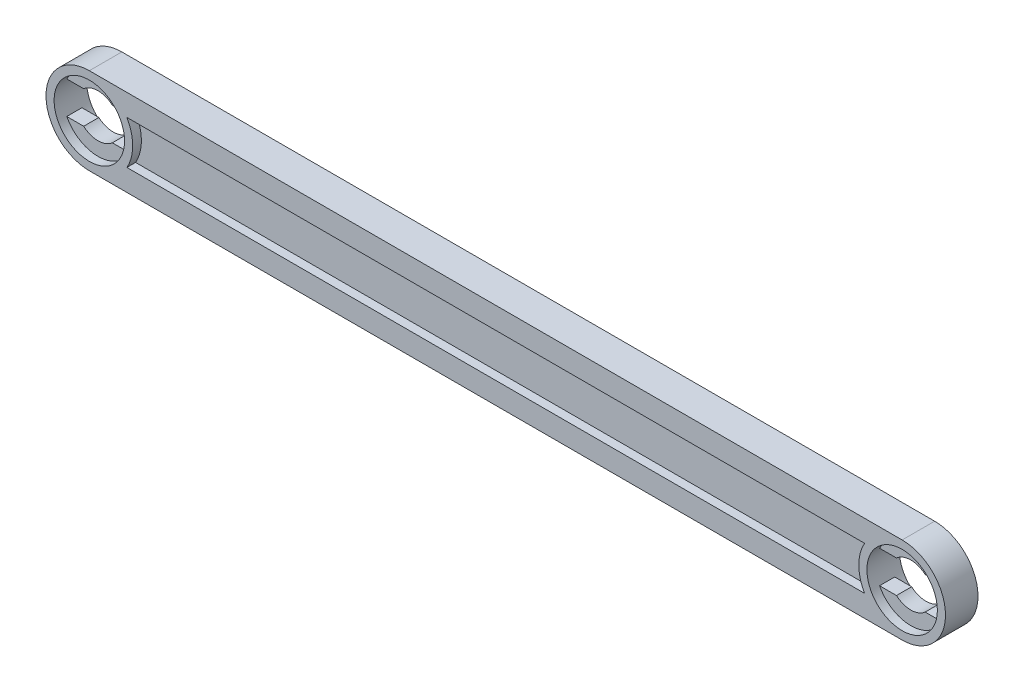
ISO-10303-21;
HEADER;
FILE_DESCRIPTION(('STEP AP214'),'2;1');
FILE_NAME('part.step','',(''),(''),'','','');
FILE_SCHEMA(('AUTOMOTIVE_DESIGN { 1 0 10303 214 1 1 1 1 }'));
ENDSEC;
DATA;
#1=APPLICATION_CONTEXT('core data for automotive mechanical design processes');
#2=APPLICATION_PROTOCOL_DEFINITION('international standard','automotive_design',2000,#1);
#3=PRODUCT_CONTEXT('',#1,'mechanical');
#4=PRODUCT('Part','Part','',(#3));
#5=PRODUCT_RELATED_PRODUCT_CATEGORY('part','',(#4));
#6=PRODUCT_DEFINITION_FORMATION('','',#4);
#7=PRODUCT_DEFINITION_CONTEXT('part definition',#1,'design');
#8=PRODUCT_DEFINITION('design','',#6,#7);
#9=PRODUCT_DEFINITION_SHAPE('','',#8);
#10=(LENGTH_UNIT() NAMED_UNIT(*) SI_UNIT(.MILLI.,.METRE.));
#11=(NAMED_UNIT(*) PLANE_ANGLE_UNIT() SI_UNIT($,.RADIAN.));
#12=(NAMED_UNIT(*) SI_UNIT($,.STERADIAN.) SOLID_ANGLE_UNIT());
#13=UNCERTAINTY_MEASURE_WITH_UNIT(LENGTH_MEASURE(1.E-05),#10,'distance_accuracy_value','');
#14=(GEOMETRIC_REPRESENTATION_CONTEXT(3) GLOBAL_UNCERTAINTY_ASSIGNED_CONTEXT((#13)) GLOBAL_UNIT_ASSIGNED_CONTEXT((#10,
#11,#12)) REPRESENTATION_CONTEXT('',''));
#15=CARTESIAN_POINT('',(0.,0.,0.));
#16=DIRECTION('',(0.,0.,1.));
#17=DIRECTION('',(1.,0.,0.));
#18=AXIS2_PLACEMENT_3D('',#15,#16,#17);
#19=CARTESIAN_POINT('',(0.,0.,0.));
#20=DIRECTION('',(0.,0.,1.));
#21=DIRECTION('',(1.,0.,0.));
#22=AXIS2_PLACEMENT_3D('',#19,#20,#21);
#23=PLANE('',#22);
#24=CARTESIAN_POINT('',(75.,0.,0.));
#25=DIRECTION('',(0.,0.,-1.));
#26=DIRECTION('',(1.,0.,0.));
#27=AXIS2_PLACEMENT_3D('',#24,#25,#26);
#28=CIRCLE('',#27,3.99999999999999);
#29=CARTESIAN_POINT('',(71.5358983848623,-2.,0.));
#30=VERTEX_POINT('',#29);
#31=CARTESIAN_POINT('',(71.5358983848623,2.,0.));
#32=VERTEX_POINT('',#31);
#33=EDGE_CURVE('E57',#30,#32,#28,.T.);
#34=ORIENTED_EDGE('',*,*,#33,.F.);
#35=DIRECTION('',(1.,0.,0.));
#36=VECTOR('',#35,1.);
#37=CARTESIAN_POINT('',(3.46410161513775,-2.,0.));
#38=LINE('',#37,#36);
#39=CARTESIAN_POINT('',(3.46410161513775,-2.,0.));
#40=VERTEX_POINT('',#39);
#41=EDGE_CURVE('E261',#40,#30,#38,.T.);
#42=ORIENTED_EDGE('',*,*,#41,.F.);
#43=CARTESIAN_POINT('',(0.,0.,0.));
#44=DIRECTION('',(0.,0.,-1.));
#45=DIRECTION('',(1.,0.,0.));
#46=AXIS2_PLACEMENT_3D('',#43,#44,#45);
#47=CIRCLE('',#46,4.);
#48=CARTESIAN_POINT('',(3.46410161513776,2.,0.));
#49=VERTEX_POINT('',#48);
#50=EDGE_CURVE('E275',#49,#40,#47,.T.);
#51=ORIENTED_EDGE('',*,*,#50,.F.);
#52=DIRECTION('',(-1.,0.,0.));
#53=VECTOR('',#52,1.);
#54=CARTESIAN_POINT('',(3.46410161513775,2.,0.));
#55=LINE('',#54,#53);
#56=EDGE_CURVE('E272',#32,#49,#55,.T.);
#57=ORIENTED_EDGE('',*,*,#56,.F.);
#58=EDGE_LOOP('',(#34,#42,#51,#57));
#59=FACE_BOUND('',#58,.T.);
#60=CARTESIAN_POINT('',(0.,0.,0.));
#61=DIRECTION('',(0.,0.,1.));
#62=DIRECTION('',(1.,0.,0.));
#63=AXIS2_PLACEMENT_3D('',#60,#61,#62);
#64=CIRCLE('',#63,4.);
#65=CARTESIAN_POINT('',(0.,4.,0.));
#66=VERTEX_POINT('',#65);
#67=CARTESIAN_POINT('',(0.,-4.,0.));
#68=VERTEX_POINT('',#67);
#69=EDGE_CURVE('E393',#66,#68,#64,.T.);
#70=ORIENTED_EDGE('',*,*,#69,.T.);
#71=DIRECTION('',(1.,0.,0.));
#72=VECTOR('',#71,1.);
#73=CARTESIAN_POINT('',(0.,-4.,0.));
#74=LINE('',#73,#72);
#75=CARTESIAN_POINT('',(75.,-4.,0.));
#76=VERTEX_POINT('',#75);
#77=EDGE_CURVE('E423',#68,#76,#74,.T.);
#78=ORIENTED_EDGE('',*,*,#77,.T.);
#79=CARTESIAN_POINT('',(75.,0.,0.));
#80=DIRECTION('',(0.,0.,1.));
#81=DIRECTION('',(1.,0.,0.));
#82=AXIS2_PLACEMENT_3D('',#79,#80,#81);
#83=CIRCLE('',#82,4.);
#84=CARTESIAN_POINT('',(75.,4.,0.));
#85=VERTEX_POINT('',#84);
#86=EDGE_CURVE('E426',#76,#85,#83,.T.);
#87=ORIENTED_EDGE('',*,*,#86,.T.);
#88=DIRECTION('',(-1.,0.,0.));
#89=VECTOR('',#88,1.);
#90=CARTESIAN_POINT('',(0.,4.,0.));
#91=LINE('',#90,#89);
#92=EDGE_CURVE('E411',#85,#66,#91,.T.);
#93=ORIENTED_EDGE('',*,*,#92,.T.);
#94=EDGE_LOOP('',(#70,#78,#87,#93));
#95=FACE_BOUND('',#94,.T.);
#96=CARTESIAN_POINT('',(0.,0.,0.));
#97=DIRECTION('',(0.,0.,1.));
#98=DIRECTION('',(1.,0.,0.));
#99=AXIS2_PLACEMENT_3D('',#96,#97,#98);
#100=CIRCLE('',#99,3.25);
#101=CARTESIAN_POINT('',(3.25,0.,0.));
#102=VERTEX_POINT('',#101);
#103=EDGE_CURVE('E387',#102,#102,#100,.T.);
#104=ORIENTED_EDGE('',*,*,#103,.F.);
#105=EDGE_LOOP('',(#104));
#106=FACE_BOUND('',#105,.T.);
#107=CARTESIAN_POINT('',(75.,0.,0.));
#108=DIRECTION('',(0.,0.,-1.));
#109=DIRECTION('',(-1.,0.,0.));
#110=AXIS2_PLACEMENT_3D('',#107,#108,#109);
#111=CIRCLE('',#110,3.25);
#112=CARTESIAN_POINT('',(71.75,0.,0.));
#113=VERTEX_POINT('',#112);
#114=EDGE_CURVE('E324',#113,#113,#111,.T.);
#115=ORIENTED_EDGE('',*,*,#114,.T.);
#116=EDGE_LOOP('',(#115));
#117=FACE_BOUND('',#116,.T.);
#118=ADVANCED_FACE('F34',(#59,#95,#106,#117),#23,.T.);
#119=CARTESIAN_POINT('',(77.8831406486677,-1.5,-3.001));
#120=DIRECTION('',(0.,1.,0.));
#121=DIRECTION('',(0.,0.,1.));
#122=AXIS2_PLACEMENT_3D('',#119,#120,#121);
#123=PLANE('',#122);
#124=DIRECTION('',(1.,0.,0.));
#125=VECTOR('',#124,1.);
#126=CARTESIAN_POINT('',(77.8831406486677,-1.5,-2.2));
#127=LINE('',#126,#125);
#128=CARTESIAN_POINT('',(76.3228756555323,-1.5,-2.2));
#129=VERTEX_POINT('',#128);
#130=CARTESIAN_POINT('',(77.8831406486677,-1.5,-2.2));
#131=VERTEX_POINT('',#130);
#132=EDGE_CURVE('E300',#129,#131,#127,.T.);
#133=ORIENTED_EDGE('',*,*,#132,.F.);
#134=DIRECTION('',(0.,0.,1.));
#135=VECTOR('',#134,1.);
#136=CARTESIAN_POINT('',(76.3228756555323,-1.5,-3.001));
#137=LINE('',#136,#135);
#138=CARTESIAN_POINT('',(76.3228756555323,-1.5,-0.8));
#139=VERTEX_POINT('',#138);
#140=EDGE_CURVE('E331',#129,#139,#137,.T.);
#141=ORIENTED_EDGE('',*,*,#140,.T.);
#142=DIRECTION('',(1.,0.,0.));
#143=VECTOR('',#142,1.);
#144=CARTESIAN_POINT('',(77.8831406486677,-1.5,-0.8));
#145=LINE('',#144,#143);
#146=CARTESIAN_POINT('',(77.8831406486677,-1.5,-0.8));
#147=VERTEX_POINT('',#146);
#148=EDGE_CURVE('E318',#139,#147,#145,.T.);
#149=ORIENTED_EDGE('',*,*,#148,.T.);
#150=DIRECTION('',(0.,0.,1.));
#151=VECTOR('',#150,1.);
#152=CARTESIAN_POINT('',(77.8831406486677,-1.5,-3.001));
#153=LINE('',#152,#151);
#154=EDGE_CURVE('E328',#131,#147,#153,.T.);
#155=ORIENTED_EDGE('',*,*,#154,.F.);
#156=EDGE_LOOP('',(#133,#141,#149,#155));
#157=FACE_BOUND('',#156,.T.);
#158=ADVANCED_FACE('F476',(#157),#123,.T.);
#159=CARTESIAN_POINT('',(75.,0.,-3.001));
#160=DIRECTION('',(0.,0.,1.));
#161=DIRECTION('',(1.,0.,0.));
#162=AXIS2_PLACEMENT_3D('',#159,#160,#161);
#163=CYLINDRICAL_SURFACE('',#162,2.);
#164=CARTESIAN_POINT('',(75.,0.,-2.2));
#165=DIRECTION('',(0.,0.,1.));
#166=DIRECTION('',(1.,0.,0.));
#167=AXIS2_PLACEMENT_3D('',#164,#165,#166);
#168=CIRCLE('',#167,2.);
#169=CARTESIAN_POINT('',(73.6771243444677,-1.5,-2.2));
#170=VERTEX_POINT('',#169);
#171=EDGE_CURVE('E298',#170,#129,#168,.T.);
#172=ORIENTED_EDGE('',*,*,#171,.F.);
#173=DIRECTION('',(0.,0.,1.));
#174=VECTOR('',#173,1.);
#175=CARTESIAN_POINT('',(73.6771243444677,-1.5,-3.001));
#176=LINE('',#175,#174);
#177=CARTESIAN_POINT('',(73.6771243444677,-1.5,-0.800000000000001));
#178=VERTEX_POINT('',#177);
#179=EDGE_CURVE('E333',#170,#178,#176,.T.);
#180=ORIENTED_EDGE('',*,*,#179,.T.);
#181=CARTESIAN_POINT('',(75.,0.,-0.8));
#182=DIRECTION('',(0.,0.,1.));
#183=DIRECTION('',(1.,0.,0.));
#184=AXIS2_PLACEMENT_3D('',#181,#182,#183);
#185=CIRCLE('',#184,2.);
#186=EDGE_CURVE('E315',#178,#139,#185,.T.);
#187=ORIENTED_EDGE('',*,*,#186,.T.);
#188=ORIENTED_EDGE('',*,*,#140,.F.);
#189=EDGE_LOOP('',(#172,#180,#187,#188));
#190=FACE_BOUND('',#189,.T.);
#191=ADVANCED_FACE('F482',(#190),#163,.F.);
#192=CARTESIAN_POINT('',(73.6771243444677,-1.5,-3.001));
#193=DIRECTION('',(0.,1.,0.));
#194=DIRECTION('',(0.,0.,1.));
#195=AXIS2_PLACEMENT_3D('',#192,#193,#194);
#196=PLANE('',#195);
#197=DIRECTION('',(1.,0.,0.));
#198=VECTOR('',#197,1.);
#199=CARTESIAN_POINT('',(73.6771243444677,-1.5,-2.2));
#200=LINE('',#199,#198);
#201=CARTESIAN_POINT('',(72.1168593513323,-1.5,-2.2));
#202=VERTEX_POINT('',#201);
#203=EDGE_CURVE('E296',#202,#170,#200,.T.);
#204=ORIENTED_EDGE('',*,*,#203,.F.);
#205=DIRECTION('',(0.,0.,1.));
#206=VECTOR('',#205,1.);
#207=CARTESIAN_POINT('',(72.1168593513323,-1.5,-3.001));
#208=LINE('',#207,#206);
#209=CARTESIAN_POINT('',(72.1168593513323,-1.5,-0.8));
#210=VERTEX_POINT('',#209);
#211=EDGE_CURVE('E335',#202,#210,#208,.T.);
#212=ORIENTED_EDGE('',*,*,#211,.T.);
#213=DIRECTION('',(1.,0.,0.));
#214=VECTOR('',#213,1.);
#215=CARTESIAN_POINT('',(73.6771243444677,-1.5,-0.8));
#216=LINE('',#215,#214);
#217=EDGE_CURVE('E312',#210,#178,#216,.T.);
#218=ORIENTED_EDGE('',*,*,#217,.T.);
#219=ORIENTED_EDGE('',*,*,#179,.F.);
#220=EDGE_LOOP('',(#204,#212,#218,#219));
#221=FACE_BOUND('',#220,.T.);
#222=ADVANCED_FACE('F586',(#221),#196,.T.);
#223=CARTESIAN_POINT('',(73.6771243444677,1.5,-3.001));
#224=DIRECTION('',(0.,-1.,0.));
#225=DIRECTION('',(0.,0.,-1.));
#226=AXIS2_PLACEMENT_3D('',#223,#224,#225);
#227=PLANE('',#226);
#228=DIRECTION('',(-1.,0.,0.));
#229=VECTOR('',#228,1.);
#230=CARTESIAN_POINT('',(73.6771243444677,1.5,-2.2));
#231=LINE('',#230,#229);
#232=CARTESIAN_POINT('',(73.6771243444677,1.5,-2.2));
#233=VERTEX_POINT('',#232);
#234=CARTESIAN_POINT('',(72.1168593513323,1.5,-2.2));
#235=VERTEX_POINT('',#234);
#236=EDGE_CURVE('E294',#233,#235,#231,.T.);
#237=ORIENTED_EDGE('',*,*,#236,.F.);
#238=DIRECTION('',(0.,0.,1.));
#239=VECTOR('',#238,1.);
#240=CARTESIAN_POINT('',(73.6771243444677,1.5,-3.001));
#241=LINE('',#240,#239);
#242=CARTESIAN_POINT('',(73.6771243444677,1.5,-0.8));
#243=VERTEX_POINT('',#242);
#244=EDGE_CURVE('E339',#233,#243,#241,.T.);
#245=ORIENTED_EDGE('',*,*,#244,.T.);
#246=DIRECTION('',(-1.,0.,0.));
#247=VECTOR('',#246,1.);
#248=CARTESIAN_POINT('',(73.6771243444677,1.5,-0.8));
#249=LINE('',#248,#247);
#250=CARTESIAN_POINT('',(72.1168593513323,1.5,-0.8));
#251=VERTEX_POINT('',#250);
#252=EDGE_CURVE('E309',#243,#251,#249,.T.);
#253=ORIENTED_EDGE('',*,*,#252,.T.);
#254=DIRECTION('',(0.,0.,1.));
#255=VECTOR('',#254,1.);
#256=CARTESIAN_POINT('',(72.1168593513323,1.5,-3.001));
#257=LINE('',#256,#255);
#258=EDGE_CURVE('E337',#235,#251,#257,.T.);
#259=ORIENTED_EDGE('',*,*,#258,.F.);
#260=EDGE_LOOP('',(#237,#245,#253,#259));
#261=FACE_BOUND('',#260,.T.);
#262=ADVANCED_FACE('F590',(#261),#227,.T.);
#263=CARTESIAN_POINT('',(75.,0.,-3.001));
#264=DIRECTION('',(0.,0.,1.));
#265=DIRECTION('',(1.,0.,0.));
#266=AXIS2_PLACEMENT_3D('',#263,#264,#265);
#267=CYLINDRICAL_SURFACE('',#266,2.);
#268=CARTESIAN_POINT('',(75.,0.,-2.2));
#269=DIRECTION('',(0.,0.,1.));
#270=DIRECTION('',(1.,0.,0.));
#271=AXIS2_PLACEMENT_3D('',#268,#269,#270);
#272=CIRCLE('',#271,2.);
#273=CARTESIAN_POINT('',(76.3228756555323,1.5,-2.2));
#274=VERTEX_POINT('',#273);
#275=EDGE_CURVE('E292',#274,#233,#272,.T.);
#276=ORIENTED_EDGE('',*,*,#275,.F.);
#277=DIRECTION('',(0.,0.,1.));
#278=VECTOR('',#277,1.);
#279=CARTESIAN_POINT('',(76.3228756555323,1.5,-3.001));
#280=LINE('',#279,#278);
#281=CARTESIAN_POINT('',(76.3228756555323,1.5,-0.800000000000001));
#282=VERTEX_POINT('',#281);
#283=EDGE_CURVE('E341',#274,#282,#280,.T.);
#284=ORIENTED_EDGE('',*,*,#283,.T.);
#285=CARTESIAN_POINT('',(75.,0.,-0.8));
#286=DIRECTION('',(0.,0.,1.));
#287=DIRECTION('',(1.,0.,0.));
#288=AXIS2_PLACEMENT_3D('',#285,#286,#287);
#289=CIRCLE('',#288,2.);
#290=EDGE_CURVE('E306',#282,#243,#289,.T.);
#291=ORIENTED_EDGE('',*,*,#290,.T.);
#292=ORIENTED_EDGE('',*,*,#244,.F.);
#293=EDGE_LOOP('',(#276,#284,#291,#292));
#294=FACE_BOUND('',#293,.T.);
#295=ADVANCED_FACE('F532',(#294),#267,.F.);
#296=CARTESIAN_POINT('',(77.8831406486677,1.5,-3.001));
#297=DIRECTION('',(0.,-1.,0.));
#298=DIRECTION('',(0.,0.,-1.));
#299=AXIS2_PLACEMENT_3D('',#296,#297,#298);
#300=PLANE('',#299);
#301=DIRECTION('',(-1.,0.,0.));
#302=VECTOR('',#301,1.);
#303=CARTESIAN_POINT('',(77.8831406486677,1.5,-2.2));
#304=LINE('',#303,#302);
#305=CARTESIAN_POINT('',(77.8831406486677,1.5,-2.2));
#306=VERTEX_POINT('',#305);
#307=EDGE_CURVE('E290',#306,#274,#304,.T.);
#308=ORIENTED_EDGE('',*,*,#307,.F.);
#309=DIRECTION('',(0.,0.,1.));
#310=VECTOR('',#309,1.);
#311=CARTESIAN_POINT('',(77.8831406486677,1.5,-3.001));
#312=LINE('',#311,#310);
#313=CARTESIAN_POINT('',(77.8831406486677,1.5,-0.8));
#314=VERTEX_POINT('',#313);
#315=EDGE_CURVE('E327',#306,#314,#312,.T.);
#316=ORIENTED_EDGE('',*,*,#315,.T.);
#317=DIRECTION('',(-1.,0.,0.));
#318=VECTOR('',#317,1.);
#319=CARTESIAN_POINT('',(77.8831406486677,1.5,-0.8));
#320=LINE('',#319,#318);
#321=EDGE_CURVE('E11',#314,#282,#320,.T.);
#322=ORIENTED_EDGE('',*,*,#321,.T.);
#323=ORIENTED_EDGE('',*,*,#283,.F.);
#324=EDGE_LOOP('',(#308,#316,#322,#323));
#325=FACE_BOUND('',#324,.T.);
#326=ADVANCED_FACE('F518',(#325),#300,.T.);
#327=CARTESIAN_POINT('',(0.,0.,-3.));
#328=DIRECTION('',(0.,0.,1.));
#329=DIRECTION('',(1.,0.,0.));
#330=AXIS2_PLACEMENT_3D('',#327,#328,#329);
#331=PLANE('',#330);
#332=DIRECTION('',(-1.,0.,0.));
#333=VECTOR('',#332,1.);
#334=CARTESIAN_POINT('',(71.,-2.,-3.));
#335=LINE('',#334,#333);
#336=CARTESIAN_POINT('',(71.,-2.,-3.));
#337=VERTEX_POINT('',#336);
#338=CARTESIAN_POINT('',(4.,-2.,-3.));
#339=VERTEX_POINT('',#338);
#340=EDGE_CURVE('E248',#337,#339,#335,.T.);
#341=ORIENTED_EDGE('',*,*,#340,.F.);
#342=DIRECTION('',(0.,-1.,0.));
#343=VECTOR('',#342,1.);
#344=CARTESIAN_POINT('',(71.,-2.,-3.));
#345=LINE('',#344,#343);
#346=CARTESIAN_POINT('',(71.,2.,-3.));
#347=VERTEX_POINT('',#346);
#348=EDGE_CURVE('E49',#347,#337,#345,.T.);
#349=ORIENTED_EDGE('',*,*,#348,.F.);
#350=DIRECTION('',(1.,0.,0.));
#351=VECTOR('',#350,1.);
#352=CARTESIAN_POINT('',(71.,2.,-3.));
#353=LINE('',#352,#351);
#354=CARTESIAN_POINT('',(4.,2.,-3.));
#355=VERTEX_POINT('',#354);
#356=EDGE_CURVE('E239',#355,#347,#353,.T.);
#357=ORIENTED_EDGE('',*,*,#356,.F.);
#358=DIRECTION('',(0.,1.,0.));
#359=VECTOR('',#358,1.);
#360=CARTESIAN_POINT('',(4.,-2.,-3.));
#361=LINE('',#360,#359);
#362=EDGE_CURVE('E242',#339,#355,#361,.T.);
#363=ORIENTED_EDGE('',*,*,#362,.F.);
#364=EDGE_LOOP('',(#341,#349,#357,#363));
#365=FACE_BOUND('',#364,.T.);
#366=CARTESIAN_POINT('',(0.,0.,-3.));
#367=DIRECTION('',(0.,0.,1.));
#368=DIRECTION('',(1.,0.,0.));
#369=AXIS2_PLACEMENT_3D('',#366,#367,#368);
#370=CIRCLE('',#369,3.25);
#371=CARTESIAN_POINT('',(3.25,0.,-3.));
#372=VERTEX_POINT('',#371);
#373=EDGE_CURVE('E384',#372,#372,#370,.F.);
#374=ORIENTED_EDGE('',*,*,#373,.F.);
#375=EDGE_LOOP('',(#374));
#376=FACE_BOUND('',#375,.T.);
#377=CARTESIAN_POINT('',(0.,0.,-3.));
#378=DIRECTION('',(0.,0.,1.));
#379=DIRECTION('',(1.,0.,0.));
#380=AXIS2_PLACEMENT_3D('',#377,#378,#379);
#381=CIRCLE('',#380,4.);
#382=CARTESIAN_POINT('',(0.,4.,-3.));
#383=VERTEX_POINT('',#382);
#384=CARTESIAN_POINT('',(0.,-4.,-3.));
#385=VERTEX_POINT('',#384);
#386=EDGE_CURVE('E407',#383,#385,#381,.T.);
#387=ORIENTED_EDGE('',*,*,#386,.F.);
#388=DIRECTION('',(-1.,0.,0.));
#389=VECTOR('',#388,1.);
#390=CARTESIAN_POINT('',(0.,4.,-3.));
#391=LINE('',#390,#389);
#392=CARTESIAN_POINT('',(75.,4.,-3.));
#393=VERTEX_POINT('',#392);
#394=EDGE_CURVE('E417',#393,#383,#391,.T.);
#395=ORIENTED_EDGE('',*,*,#394,.F.);
#396=CARTESIAN_POINT('',(75.,0.,-3.));
#397=DIRECTION('',(0.,0.,1.));
#398=DIRECTION('',(1.,0.,0.));
#399=AXIS2_PLACEMENT_3D('',#396,#397,#398);
#400=CIRCLE('',#399,4.);
#401=CARTESIAN_POINT('',(75.,-4.,-3.));
#402=VERTEX_POINT('',#401);
#403=EDGE_CURVE('E414',#402,#393,#400,.T.);
#404=ORIENTED_EDGE('',*,*,#403,.F.);
#405=DIRECTION('',(1.,0.,0.));
#406=VECTOR('',#405,1.);
#407=CARTESIAN_POINT('',(0.,-4.,-3.));
#408=LINE('',#407,#406);
#409=EDGE_CURVE('E410',#385,#402,#408,.T.);
#410=ORIENTED_EDGE('',*,*,#409,.F.);
#411=EDGE_LOOP('',(#387,#395,#404,#410));
#412=FACE_BOUND('',#411,.T.);
#413=CARTESIAN_POINT('',(75.,0.,-3.));
#414=DIRECTION('',(0.,0.,1.));
#415=DIRECTION('',(1.,0.,0.));
#416=AXIS2_PLACEMENT_3D('',#413,#414,#415);
#417=CIRCLE('',#416,3.25);
#418=CARTESIAN_POINT('',(78.25,0.,-3.));
#419=VERTEX_POINT('',#418);
#420=EDGE_CURVE('E321',#419,#419,#417,.T.);
#421=ORIENTED_EDGE('',*,*,#420,.T.);
#422=EDGE_LOOP('',(#421));
#423=FACE_BOUND('',#422,.T.);
#424=ADVANCED_FACE('F488',(#365,#376,#412,#423),#331,.F.);
#425=CARTESIAN_POINT('',(-2.8831406486677,1.5,-3.001));
#426=DIRECTION('',(0.,1.,0.));
#427=DIRECTION('',(0.,0.,1.));
#428=AXIS2_PLACEMENT_3D('',#425,#426,#427);
#429=PLANE('',#428);
#430=DIRECTION('',(0.,0.,1.));
#431=VECTOR('',#430,1.);
#432=CARTESIAN_POINT('',(-2.8831406486677,1.5,-3.001));
#433=LINE('',#432,#431);
#434=CARTESIAN_POINT('',(-2.8831406486677,1.5,-2.2));
#435=VERTEX_POINT('',#434);
#436=CARTESIAN_POINT('',(-2.8831406486677,1.5,-0.8));
#437=VERTEX_POINT('',#436);
#438=EDGE_CURVE('E391',#435,#437,#433,.T.);
#439=ORIENTED_EDGE('',*,*,#438,.F.);
#440=DIRECTION('',(1.,0.,0.));
#441=VECTOR('',#440,1.);
#442=CARTESIAN_POINT('',(-2.8831406486677,1.5,-2.2));
#443=LINE('',#442,#441);
#444=CARTESIAN_POINT('',(-1.3228756555323,1.5,-2.2));
#445=VERTEX_POINT('',#444);
#446=EDGE_CURVE('E362',#435,#445,#443,.T.);
#447=ORIENTED_EDGE('',*,*,#446,.T.);
#448=DIRECTION('',(0.,0.,1.));
#449=VECTOR('',#448,1.);
#450=CARTESIAN_POINT('',(-1.3228756555323,1.5,-3.001));
#451=LINE('',#450,#449);
#452=CARTESIAN_POINT('',(-1.3228756555323,1.5,-0.8));
#453=VERTEX_POINT('',#452);
#454=EDGE_CURVE('E394',#445,#453,#451,.T.);
#455=ORIENTED_EDGE('',*,*,#454,.T.);
#456=DIRECTION('',(1.,0.,0.));
#457=VECTOR('',#456,1.);
#458=CARTESIAN_POINT('',(-2.8831406486677,1.5,-0.8));
#459=LINE('',#458,#457);
#460=EDGE_CURVE('E381',#437,#453,#459,.T.);
#461=ORIENTED_EDGE('',*,*,#460,.F.);
#462=EDGE_LOOP('',(#439,#447,#455,#461));
#463=FACE_BOUND('',#462,.T.);
#464=ADVANCED_FACE('F517',(#463),#429,.F.);
#465=CARTESIAN_POINT('',(0.,0.,-3.001));
#466=DIRECTION('',(0.,0.,1.));
#467=DIRECTION('',(1.,0.,0.));
#468=AXIS2_PLACEMENT_3D('',#465,#466,#467);
#469=CYLINDRICAL_SURFACE('',#468,2.);
#470=ORIENTED_EDGE('',*,*,#454,.F.);
#471=CARTESIAN_POINT('',(0.,0.,-2.2));
#472=DIRECTION('',(0.,0.,1.));
#473=DIRECTION('',(1.,0.,0.));
#474=AXIS2_PLACEMENT_3D('',#471,#472,#473);
#475=CIRCLE('',#474,2.);
#476=CARTESIAN_POINT('',(1.3228756555323,1.5,-2.2));
#477=VERTEX_POINT('',#476);
#478=EDGE_CURVE('E359',#445,#477,#475,.F.);
#479=ORIENTED_EDGE('',*,*,#478,.T.);
#480=DIRECTION('',(0.,0.,1.));
#481=VECTOR('',#480,1.);
#482=CARTESIAN_POINT('',(1.3228756555323,1.5,-3.001));
#483=LINE('',#482,#481);
#484=CARTESIAN_POINT('',(1.3228756555323,1.5,-0.800000000000001));
#485=VERTEX_POINT('',#484);
#486=EDGE_CURVE('E396',#477,#485,#483,.T.);
#487=ORIENTED_EDGE('',*,*,#486,.T.);
#488=CARTESIAN_POINT('',(0.,0.,-0.8));
#489=DIRECTION('',(0.,0.,1.));
#490=DIRECTION('',(1.,0.,0.));
#491=AXIS2_PLACEMENT_3D('',#488,#489,#490);
#492=CIRCLE('',#491,2.);
#493=EDGE_CURVE('E378',#453,#485,#492,.F.);
#494=ORIENTED_EDGE('',*,*,#493,.F.);
#495=EDGE_LOOP('',(#470,#479,#487,#494));
#496=FACE_BOUND('',#495,.T.);
#497=ADVANCED_FACE('F529',(#496),#469,.F.);
#498=CARTESIAN_POINT('',(1.3228756555323,1.5,-3.001));
#499=DIRECTION('',(0.,1.,0.));
#500=DIRECTION('',(0.,0.,1.));
#501=AXIS2_PLACEMENT_3D('',#498,#499,#500);
#502=PLANE('',#501);
#503=ORIENTED_EDGE('',*,*,#486,.F.);
#504=DIRECTION('',(1.,0.,0.));
#505=VECTOR('',#504,1.);
#506=CARTESIAN_POINT('',(1.3228756555323,1.5,-2.2));
#507=LINE('',#506,#505);
#508=CARTESIAN_POINT('',(2.8831406486677,1.5,-2.2));
#509=VERTEX_POINT('',#508);
#510=EDGE_CURVE('E356',#477,#509,#507,.T.);
#511=ORIENTED_EDGE('',*,*,#510,.T.);
#512=DIRECTION('',(0.,0.,1.));
#513=VECTOR('',#512,1.);
#514=CARTESIAN_POINT('',(2.8831406486677,1.5,-3.001));
#515=LINE('',#514,#513);
#516=CARTESIAN_POINT('',(2.8831406486677,1.5,-0.8));
#517=VERTEX_POINT('',#516);
#518=EDGE_CURVE('E398',#509,#517,#515,.T.);
#519=ORIENTED_EDGE('',*,*,#518,.T.);
#520=DIRECTION('',(1.,0.,0.));
#521=VECTOR('',#520,1.);
#522=CARTESIAN_POINT('',(1.3228756555323,1.5,-0.8));
#523=LINE('',#522,#521);
#524=EDGE_CURVE('E375',#485,#517,#523,.T.);
#525=ORIENTED_EDGE('',*,*,#524,.F.);
#526=EDGE_LOOP('',(#503,#511,#519,#525));
#527=FACE_BOUND('',#526,.T.);
#528=ADVANCED_FACE('F807',(#527),#502,.F.);
#529=CARTESIAN_POINT('',(1.3228756555323,-1.5,-3.001));
#530=DIRECTION('',(0.,-1.,0.));
#531=DIRECTION('',(0.,0.,-1.));
#532=AXIS2_PLACEMENT_3D('',#529,#530,#531);
#533=PLANE('',#532);
#534=DIRECTION('',(0.,0.,1.));
#535=VECTOR('',#534,1.);
#536=CARTESIAN_POINT('',(2.8831406486677,-1.5,-3.001));
#537=LINE('',#536,#535);
#538=CARTESIAN_POINT('',(2.8831406486677,-1.5,-2.2));
#539=VERTEX_POINT('',#538);
#540=CARTESIAN_POINT('',(2.8831406486677,-1.5,-0.8));
#541=VERTEX_POINT('',#540);
#542=EDGE_CURVE('E400',#539,#541,#537,.T.);
#543=ORIENTED_EDGE('',*,*,#542,.F.);
#544=DIRECTION('',(-1.,0.,0.));
#545=VECTOR('',#544,1.);
#546=CARTESIAN_POINT('',(1.3228756555323,-1.5,-2.2));
#547=LINE('',#546,#545);
#548=CARTESIAN_POINT('',(1.32287565553229,-1.5,-2.2));
#549=VERTEX_POINT('',#548);
#550=EDGE_CURVE('E353',#539,#549,#547,.T.);
#551=ORIENTED_EDGE('',*,*,#550,.T.);
#552=DIRECTION('',(0.,0.,1.));
#553=VECTOR('',#552,1.);
#554=CARTESIAN_POINT('',(1.32287565553229,-1.5,-3.001));
#555=LINE('',#554,#553);
#556=CARTESIAN_POINT('',(1.32287565553229,-1.5,-0.8));
#557=VERTEX_POINT('',#556);
#558=EDGE_CURVE('E402',#549,#557,#555,.T.);
#559=ORIENTED_EDGE('',*,*,#558,.T.);
#560=DIRECTION('',(-1.,0.,0.));
#561=VECTOR('',#560,1.);
#562=CARTESIAN_POINT('',(1.3228756555323,-1.5,-0.8));
#563=LINE('',#562,#561);
#564=EDGE_CURVE('E372',#541,#557,#563,.T.);
#565=ORIENTED_EDGE('',*,*,#564,.F.);
#566=EDGE_LOOP('',(#543,#551,#559,#565));
#567=FACE_BOUND('',#566,.T.);
#568=ADVANCED_FACE('F454',(#567),#533,.F.);
#569=CARTESIAN_POINT('',(0.,0.,-3.001));
#570=DIRECTION('',(0.,0.,1.));
#571=DIRECTION('',(1.,0.,0.));
#572=AXIS2_PLACEMENT_3D('',#569,#570,#571);
#573=CYLINDRICAL_SURFACE('',#572,2.);
#574=ORIENTED_EDGE('',*,*,#558,.F.);
#575=CARTESIAN_POINT('',(0.,0.,-2.2));
#576=DIRECTION('',(0.,0.,1.));
#577=DIRECTION('',(1.,0.,0.));
#578=AXIS2_PLACEMENT_3D('',#575,#576,#577);
#579=CIRCLE('',#578,2.);
#580=CARTESIAN_POINT('',(-1.3228756555323,-1.5,-2.2));
#581=VERTEX_POINT('',#580);
#582=EDGE_CURVE('E350',#549,#581,#579,.F.);
#583=ORIENTED_EDGE('',*,*,#582,.T.);
#584=DIRECTION('',(0.,0.,1.));
#585=VECTOR('',#584,1.);
#586=CARTESIAN_POINT('',(-1.3228756555323,-1.5,-3.001));
#587=LINE('',#586,#585);
#588=CARTESIAN_POINT('',(-1.3228756555323,-1.5,-0.800000000000001));
#589=VERTEX_POINT('',#588);
#590=EDGE_CURVE('E404',#581,#589,#587,.T.);
#591=ORIENTED_EDGE('',*,*,#590,.T.);
#592=CARTESIAN_POINT('',(0.,0.,-0.8));
#593=DIRECTION('',(0.,0.,1.));
#594=DIRECTION('',(1.,0.,0.));
#595=AXIS2_PLACEMENT_3D('',#592,#593,#594);
#596=CIRCLE('',#595,2.);
#597=EDGE_CURVE('E369',#557,#589,#596,.F.);
#598=ORIENTED_EDGE('',*,*,#597,.F.);
#599=EDGE_LOOP('',(#574,#583,#591,#598));
#600=FACE_BOUND('',#599,.T.);
#601=ADVANCED_FACE('F457',(#600),#573,.F.);
#602=CARTESIAN_POINT('',(-2.8831406486677,-1.5,-3.001));
#603=DIRECTION('',(0.,-1.,0.));
#604=DIRECTION('',(0.,0.,-1.));
#605=AXIS2_PLACEMENT_3D('',#602,#603,#604);
#606=PLANE('',#605);
#607=ORIENTED_EDGE('',*,*,#590,.F.);
#608=DIRECTION('',(-1.,0.,0.));
#609=VECTOR('',#608,1.);
#610=CARTESIAN_POINT('',(-2.8831406486677,-1.5,-2.2));
#611=LINE('',#610,#609);
#612=CARTESIAN_POINT('',(-2.8831406486677,-1.5,-2.2));
#613=VERTEX_POINT('',#612);
#614=EDGE_CURVE('E347',#581,#613,#611,.T.);
#615=ORIENTED_EDGE('',*,*,#614,.T.);
#616=DIRECTION('',(0.,0.,1.));
#617=VECTOR('',#616,1.);
#618=CARTESIAN_POINT('',(-2.8831406486677,-1.5,-3.001));
#619=LINE('',#618,#617);
#620=CARTESIAN_POINT('',(-2.8831406486677,-1.5,-0.8));
#621=VERTEX_POINT('',#620);
#622=EDGE_CURVE('E390',#613,#621,#619,.T.);
#623=ORIENTED_EDGE('',*,*,#622,.T.);
#624=DIRECTION('',(-1.,0.,0.));
#625=VECTOR('',#624,1.);
#626=CARTESIAN_POINT('',(-2.8831406486677,-1.5,-0.8));
#627=LINE('',#626,#625);
#628=EDGE_CURVE('E42',#589,#621,#627,.T.);
#629=ORIENTED_EDGE('',*,*,#628,.F.);
#630=EDGE_LOOP('',(#607,#615,#623,#629));
#631=FACE_BOUND('',#630,.T.);
#632=ADVANCED_FACE('F458',(#631),#606,.F.);
#633=CARTESIAN_POINT('',(0.,0.,-3.));
#634=DIRECTION('',(0.,0.,1.));
#635=DIRECTION('',(1.,0.,0.));
#636=AXIS2_PLACEMENT_3D('',#633,#634,#635);
#637=CYLINDRICAL_SURFACE('',#636,4.);
#638=ORIENTED_EDGE('',*,*,#69,.F.);
#639=DIRECTION('',(0.,0.,1.));
#640=VECTOR('',#639,1.);
#641=CARTESIAN_POINT('',(0.,4.,-3.));
#642=LINE('',#641,#640);
#643=EDGE_CURVE('E431',#383,#66,#642,.T.);
#644=ORIENTED_EDGE('',*,*,#643,.F.);
#645=ORIENTED_EDGE('',*,*,#386,.T.);
#646=DIRECTION('',(0.,0.,1.));
#647=VECTOR('',#646,1.);
#648=CARTESIAN_POINT('',(0.,-4.,-3.));
#649=LINE('',#648,#647);
#650=EDGE_CURVE('E420',#385,#68,#649,.T.);
#651=ORIENTED_EDGE('',*,*,#650,.T.);
#652=EDGE_LOOP('',(#638,#644,#645,#651));
#653=FACE_BOUND('',#652,.T.);
#654=ADVANCED_FACE('F36',(#653),#637,.T.);
#655=CARTESIAN_POINT('',(0.,4.,-3.));
#656=DIRECTION('',(0.,1.,0.));
#657=DIRECTION('',(0.,0.,1.));
#658=AXIS2_PLACEMENT_3D('',#655,#656,#657);
#659=PLANE('',#658);
#660=ORIENTED_EDGE('',*,*,#92,.F.);
#661=DIRECTION('',(0.,0.,1.));
#662=VECTOR('',#661,1.);
#663=CARTESIAN_POINT('',(75.,4.,-3.));
#664=LINE('',#663,#662);
#665=EDGE_CURVE('E433',#393,#85,#664,.T.);
#666=ORIENTED_EDGE('',*,*,#665,.F.);
#667=ORIENTED_EDGE('',*,*,#394,.T.);
#668=ORIENTED_EDGE('',*,*,#643,.T.);
#669=EDGE_LOOP('',(#660,#666,#667,#668));
#670=FACE_BOUND('',#669,.T.);
#671=ADVANCED_FACE('F490',(#670),#659,.T.);
#672=CARTESIAN_POINT('',(75.,0.,-3.));
#673=DIRECTION('',(0.,0.,1.));
#674=DIRECTION('',(1.,0.,0.));
#675=AXIS2_PLACEMENT_3D('',#672,#673,#674);
#676=CYLINDRICAL_SURFACE('',#675,4.);
#677=ORIENTED_EDGE('',*,*,#86,.F.);
#678=DIRECTION('',(0.,0.,1.));
#679=VECTOR('',#678,1.);
#680=CARTESIAN_POINT('',(75.,-4.,-3.));
#681=LINE('',#680,#679);
#682=EDGE_CURVE('E435',#402,#76,#681,.T.);
#683=ORIENTED_EDGE('',*,*,#682,.F.);
#684=ORIENTED_EDGE('',*,*,#403,.T.);
#685=ORIENTED_EDGE('',*,*,#665,.T.);
#686=EDGE_LOOP('',(#677,#683,#684,#685));
#687=FACE_BOUND('',#686,.T.);
#688=ADVANCED_FACE('F493',(#687),#676,.T.);
#689=CARTESIAN_POINT('',(0.,-4.,-3.));
#690=DIRECTION('',(0.,-1.,0.));
#691=DIRECTION('',(0.,0.,-1.));
#692=AXIS2_PLACEMENT_3D('',#689,#690,#691);
#693=PLANE('',#692);
#694=ORIENTED_EDGE('',*,*,#77,.F.);
#695=ORIENTED_EDGE('',*,*,#650,.F.);
#696=ORIENTED_EDGE('',*,*,#409,.T.);
#697=ORIENTED_EDGE('',*,*,#682,.T.);
#698=EDGE_LOOP('',(#694,#695,#696,#697));
#699=FACE_BOUND('',#698,.T.);
#700=ADVANCED_FACE('F496',(#699),#693,.T.);
#701=CARTESIAN_POINT('',(0.,0.,-3.001));
#702=DIRECTION('',(0.,0.,1.));
#703=DIRECTION('',(1.,0.,0.));
#704=AXIS2_PLACEMENT_3D('',#701,#702,#703);
#705=CYLINDRICAL_SURFACE('',#704,3.25);
#706=CARTESIAN_POINT('',(0.,0.,-2.2));
#707=DIRECTION('',(0.,0.,1.));
#708=DIRECTION('',(1.,0.,0.));
#709=AXIS2_PLACEMENT_3D('',#706,#707,#708);
#710=CIRCLE('',#709,3.25);
#711=EDGE_CURVE('E344',#509,#435,#710,.T.);
#712=ORIENTED_EDGE('',*,*,#711,.T.);
#713=ORIENTED_EDGE('',*,*,#438,.T.);
#714=CARTESIAN_POINT('',(0.,0.,-0.8));
#715=DIRECTION('',(0.,0.,1.));
#716=DIRECTION('',(1.,0.,0.));
#717=AXIS2_PLACEMENT_3D('',#714,#715,#716);
#718=CIRCLE('',#717,3.25);
#719=EDGE_CURVE('E366',#517,#437,#718,.T.);
#720=ORIENTED_EDGE('',*,*,#719,.F.);
#721=ORIENTED_EDGE('',*,*,#518,.F.);
#722=EDGE_LOOP('',(#712,#713,#720,#721));
#723=FACE_BOUND('',#722,.T.);
#724=EDGE_CURVE('E330',#613,#539,#710,.T.);
#725=ORIENTED_EDGE('',*,*,#724,.T.);
#726=ORIENTED_EDGE('',*,*,#542,.T.);
#727=EDGE_CURVE('E365',#621,#541,#718,.T.);
#728=ORIENTED_EDGE('',*,*,#727,.F.);
#729=ORIENTED_EDGE('',*,*,#622,.F.);
#730=EDGE_LOOP('',(#725,#726,#728,#729));
#731=FACE_BOUND('',#730,.T.);
#732=ORIENTED_EDGE('',*,*,#103,.T.);
#733=EDGE_LOOP('',(#732));
#734=FACE_BOUND('',#733,.T.);
#735=ORIENTED_EDGE('',*,*,#373,.T.);
#736=EDGE_LOOP('',(#735));
#737=FACE_BOUND('',#736,.T.);
#738=ADVANCED_FACE('F450',(#723,#731,#734,#737),#705,.F.);
#739=CARTESIAN_POINT('',(0.,0.,-0.8));
#740=DIRECTION('',(0.,0.,1.));
#741=DIRECTION('',(1.,0.,0.));
#742=AXIS2_PLACEMENT_3D('',#739,#740,#741);
#743=PLANE('',#742);
#744=ORIENTED_EDGE('',*,*,#564,.T.);
#745=ORIENTED_EDGE('',*,*,#597,.T.);
#746=ORIENTED_EDGE('',*,*,#628,.T.);
#747=ORIENTED_EDGE('',*,*,#727,.T.);
#748=EDGE_LOOP('',(#744,#745,#746,#747));
#749=FACE_BOUND('',#748,.T.);
#750=ADVANCED_FACE('F442',(#749),#743,.T.);
#751=ORIENTED_EDGE('',*,*,#460,.T.);
#752=ORIENTED_EDGE('',*,*,#493,.T.);
#753=ORIENTED_EDGE('',*,*,#524,.T.);
#754=ORIENTED_EDGE('',*,*,#719,.T.);
#755=EDGE_LOOP('',(#751,#752,#753,#754));
#756=FACE_BOUND('',#755,.T.);
#757=ADVANCED_FACE('F472',(#756),#743,.T.);
#758=CARTESIAN_POINT('',(0.,0.,-2.2));
#759=DIRECTION('',(0.,0.,1.));
#760=DIRECTION('',(1.,0.,0.));
#761=AXIS2_PLACEMENT_3D('',#758,#759,#760);
#762=PLANE('',#761);
#763=ORIENTED_EDGE('',*,*,#711,.F.);
#764=ORIENTED_EDGE('',*,*,#510,.F.);
#765=ORIENTED_EDGE('',*,*,#478,.F.);
#766=ORIENTED_EDGE('',*,*,#446,.F.);
#767=EDGE_LOOP('',(#763,#764,#765,#766));
#768=FACE_BOUND('',#767,.T.);
#769=ADVANCED_FACE('F463',(#768),#762,.F.);
#770=ORIENTED_EDGE('',*,*,#724,.F.);
#771=ORIENTED_EDGE('',*,*,#614,.F.);
#772=ORIENTED_EDGE('',*,*,#582,.F.);
#773=ORIENTED_EDGE('',*,*,#550,.F.);
#774=EDGE_LOOP('',(#770,#771,#772,#773));
#775=FACE_BOUND('',#774,.T.);
#776=ADVANCED_FACE('F460',(#775),#762,.F.);
#777=CARTESIAN_POINT('',(75.,0.,-3.001));
#778=DIRECTION('',(0.,0.,1.));
#779=DIRECTION('',(1.,0.,0.));
#780=AXIS2_PLACEMENT_3D('',#777,#778,#779);
#781=CYLINDRICAL_SURFACE('',#780,3.25);
#782=CARTESIAN_POINT('',(75.,0.,-2.2));
#783=DIRECTION('',(0.,0.,-1.));
#784=DIRECTION('',(-1.,0.,0.));
#785=AXIS2_PLACEMENT_3D('',#782,#783,#784);
#786=CIRCLE('',#785,3.25);
#787=EDGE_CURVE('E282',#131,#202,#786,.T.);
#788=ORIENTED_EDGE('',*,*,#787,.F.);
#789=ORIENTED_EDGE('',*,*,#154,.T.);
#790=CARTESIAN_POINT('',(75.,0.,-0.8));
#791=DIRECTION('',(0.,0.,-1.));
#792=DIRECTION('',(-1.,0.,0.));
#793=AXIS2_PLACEMENT_3D('',#790,#791,#792);
#794=CIRCLE('',#793,3.25);
#795=EDGE_CURVE('E302',#147,#210,#794,.T.);
#796=ORIENTED_EDGE('',*,*,#795,.T.);
#797=ORIENTED_EDGE('',*,*,#211,.F.);
#798=EDGE_LOOP('',(#788,#789,#796,#797));
#799=FACE_BOUND('',#798,.T.);
#800=EDGE_CURVE('E288',#235,#306,#786,.T.);
#801=ORIENTED_EDGE('',*,*,#800,.F.);
#802=ORIENTED_EDGE('',*,*,#258,.T.);
#803=EDGE_CURVE('E303',#251,#314,#794,.T.);
#804=ORIENTED_EDGE('',*,*,#803,.T.);
#805=ORIENTED_EDGE('',*,*,#315,.F.);
#806=EDGE_LOOP('',(#801,#802,#804,#805));
#807=FACE_BOUND('',#806,.T.);
#808=ORIENTED_EDGE('',*,*,#420,.F.);
#809=EDGE_LOOP('',(#808));
#810=FACE_BOUND('',#809,.T.);
#811=ORIENTED_EDGE('',*,*,#114,.F.);
#812=EDGE_LOOP('',(#811));
#813=FACE_BOUND('',#812,.T.);
#814=ADVANCED_FACE('F462',(#799,#807,#810,#813),#781,.F.);
#815=CARTESIAN_POINT('',(75.,0.,-0.8));
#816=DIRECTION('',(0.,0.,1.));
#817=DIRECTION('',(-1.,0.,0.));
#818=AXIS2_PLACEMENT_3D('',#815,#816,#817);
#819=PLANE('',#818);
#820=ORIENTED_EDGE('',*,*,#290,.F.);
#821=ORIENTED_EDGE('',*,*,#321,.F.);
#822=ORIENTED_EDGE('',*,*,#803,.F.);
#823=ORIENTED_EDGE('',*,*,#252,.F.);
#824=EDGE_LOOP('',(#820,#821,#822,#823));
#825=FACE_BOUND('',#824,.T.);
#826=ADVANCED_FACE('F469',(#825),#819,.T.);
#827=ORIENTED_EDGE('',*,*,#186,.F.);
#828=ORIENTED_EDGE('',*,*,#217,.F.);
#829=ORIENTED_EDGE('',*,*,#795,.F.);
#830=ORIENTED_EDGE('',*,*,#148,.F.);
#831=EDGE_LOOP('',(#827,#828,#829,#830));
#832=FACE_BOUND('',#831,.T.);
#833=ADVANCED_FACE('F581',(#832),#819,.T.);
#834=CARTESIAN_POINT('',(75.,0.,-2.2));
#835=DIRECTION('',(0.,0.,1.));
#836=DIRECTION('',(-1.,0.,0.));
#837=AXIS2_PLACEMENT_3D('',#834,#835,#836);
#838=PLANE('',#837);
#839=ORIENTED_EDGE('',*,*,#132,.T.);
#840=ORIENTED_EDGE('',*,*,#787,.T.);
#841=ORIENTED_EDGE('',*,*,#203,.T.);
#842=ORIENTED_EDGE('',*,*,#171,.T.);
#843=EDGE_LOOP('',(#839,#840,#841,#842));
#844=FACE_BOUND('',#843,.T.);
#845=ADVANCED_FACE('F578',(#844),#838,.F.);
#846=ORIENTED_EDGE('',*,*,#236,.T.);
#847=ORIENTED_EDGE('',*,*,#800,.T.);
#848=ORIENTED_EDGE('',*,*,#307,.T.);
#849=ORIENTED_EDGE('',*,*,#275,.T.);
#850=EDGE_LOOP('',(#846,#847,#848,#849));
#851=FACE_BOUND('',#850,.T.);
#852=ADVANCED_FACE('F575',(#851),#838,.F.);
#853=CARTESIAN_POINT('',(75.,0.,-0.8));
#854=DIRECTION('',(0.,0.,1.));
#855=DIRECTION('',(1.,0.,0.));
#856=AXIS2_PLACEMENT_3D('',#853,#854,#855);
#857=CYLINDRICAL_SURFACE('',#856,3.99999999999999);
#858=ORIENTED_EDGE('',*,*,#33,.T.);
#859=DIRECTION('',(0.,0.,1.));
#860=VECTOR('',#859,1.);
#861=CARTESIAN_POINT('',(71.5358983848623,2.,-0.8));
#862=LINE('',#861,#860);
#863=CARTESIAN_POINT('',(71.5358983848623,2.,-0.8));
#864=VERTEX_POINT('',#863);
#865=EDGE_CURVE('E270',#864,#32,#862,.T.);
#866=ORIENTED_EDGE('',*,*,#865,.F.);
#867=CARTESIAN_POINT('',(75.,0.,-0.8));
#868=DIRECTION('',(0.,0.,-1.));
#869=DIRECTION('',(1.,0.,0.));
#870=AXIS2_PLACEMENT_3D('',#867,#868,#869);
#871=CIRCLE('',#870,3.99999999999999);
#872=CARTESIAN_POINT('',(71.5358983848623,-2.,-0.8));
#873=VERTEX_POINT('',#872);
#874=EDGE_CURVE('E257',#873,#864,#871,.T.);
#875=ORIENTED_EDGE('',*,*,#874,.F.);
#876=DIRECTION('',(0.,0.,1.));
#877=VECTOR('',#876,1.);
#878=CARTESIAN_POINT('',(71.5358983848623,-2.,-0.8));
#879=LINE('',#878,#877);
#880=EDGE_CURVE('E280',#873,#30,#879,.T.);
#881=ORIENTED_EDGE('',*,*,#880,.T.);
#882=EDGE_LOOP('',(#858,#866,#875,#881));
#883=FACE_BOUND('',#882,.T.);
#884=ADVANCED_FACE('F565',(#883),#857,.T.);
#885=CARTESIAN_POINT('',(3.46410161513775,-2.,-0.8));
#886=DIRECTION('',(0.,-1.,0.));
#887=DIRECTION('',(1.,0.,0.));
#888=AXIS2_PLACEMENT_3D('',#885,#886,#887);
#889=PLANE('',#888);
#890=ORIENTED_EDGE('',*,*,#41,.T.);
#891=ORIENTED_EDGE('',*,*,#880,.F.);
#892=DIRECTION('',(1.,0.,0.));
#893=VECTOR('',#892,1.);
#894=CARTESIAN_POINT('',(3.46410161513775,-2.,-0.8));
#895=LINE('',#894,#893);
#896=CARTESIAN_POINT('',(3.46410161513775,-2.,-0.8));
#897=VERTEX_POINT('',#896);
#898=EDGE_CURVE('E267',#897,#873,#895,.T.);
#899=ORIENTED_EDGE('',*,*,#898,.F.);
#900=DIRECTION('',(0.,0.,1.));
#901=VECTOR('',#900,1.);
#902=CARTESIAN_POINT('',(3.46410161513775,-2.,-0.8));
#903=LINE('',#902,#901);
#904=EDGE_CURVE('E283',#897,#40,#903,.T.);
#905=ORIENTED_EDGE('',*,*,#904,.T.);
#906=EDGE_LOOP('',(#890,#891,#899,#905));
#907=FACE_BOUND('',#906,.T.);
#908=ADVANCED_FACE('F561',(#907),#889,.F.);
#909=CARTESIAN_POINT('',(0.,0.,-0.8));
#910=DIRECTION('',(0.,0.,1.));
#911=DIRECTION('',(1.,0.,0.));
#912=AXIS2_PLACEMENT_3D('',#909,#910,#911);
#913=CYLINDRICAL_SURFACE('',#912,4.);
#914=ORIENTED_EDGE('',*,*,#50,.T.);
#915=ORIENTED_EDGE('',*,*,#904,.F.);
#916=CARTESIAN_POINT('',(0.,0.,-0.8));
#917=DIRECTION('',(0.,0.,-1.));
#918=DIRECTION('',(1.,0.,0.));
#919=AXIS2_PLACEMENT_3D('',#916,#917,#918);
#920=CIRCLE('',#919,4.);
#921=CARTESIAN_POINT('',(3.46410161513776,2.,-0.8));
#922=VERTEX_POINT('',#921);
#923=EDGE_CURVE('E264',#922,#897,#920,.T.);
#924=ORIENTED_EDGE('',*,*,#923,.F.);
#925=DIRECTION('',(0.,0.,1.));
#926=VECTOR('',#925,1.);
#927=CARTESIAN_POINT('',(3.46410161513776,2.,-0.8));
#928=LINE('',#927,#926);
#929=EDGE_CURVE('E285',#922,#49,#928,.T.);
#930=ORIENTED_EDGE('',*,*,#929,.T.);
#931=EDGE_LOOP('',(#914,#915,#924,#930));
#932=FACE_BOUND('',#931,.T.);
#933=ADVANCED_FACE('F564',(#932),#913,.T.);
#934=CARTESIAN_POINT('',(3.46410161513775,2.,-0.8));
#935=DIRECTION('',(0.,1.,0.));
#936=DIRECTION('',(0.,0.,1.));
#937=AXIS2_PLACEMENT_3D('',#934,#935,#936);
#938=PLANE('',#937);
#939=ORIENTED_EDGE('',*,*,#56,.T.);
#940=ORIENTED_EDGE('',*,*,#929,.F.);
#941=DIRECTION('',(-1.,0.,0.));
#942=VECTOR('',#941,1.);
#943=CARTESIAN_POINT('',(3.46410161513775,2.,-0.8));
#944=LINE('',#943,#942);
#945=EDGE_CURVE('E260',#864,#922,#944,.T.);
#946=ORIENTED_EDGE('',*,*,#945,.F.);
#947=ORIENTED_EDGE('',*,*,#865,.T.);
#948=EDGE_LOOP('',(#939,#940,#946,#947));
#949=FACE_BOUND('',#948,.T.);
#950=ADVANCED_FACE('F559',(#949),#938,.F.);
#951=CARTESIAN_POINT('',(75.,0.,-0.8));
#952=DIRECTION('',(0.,0.,1.));
#953=DIRECTION('',(1.,0.,0.));
#954=AXIS2_PLACEMENT_3D('',#951,#952,#953);
#955=PLANE('',#954);
#956=ORIENTED_EDGE('',*,*,#874,.T.);
#957=ORIENTED_EDGE('',*,*,#945,.T.);
#958=ORIENTED_EDGE('',*,*,#923,.T.);
#959=ORIENTED_EDGE('',*,*,#898,.T.);
#960=EDGE_LOOP('',(#956,#957,#958,#959));
#961=FACE_BOUND('',#960,.T.);
#962=ADVANCED_FACE('F551',(#961),#955,.T.);
#963=CARTESIAN_POINT('',(71.,-2.,-2.2));
#964=DIRECTION('',(1.,0.,0.));
#965=DIRECTION('',(0.,0.,-1.));
#966=AXIS2_PLACEMENT_3D('',#963,#964,#965);
#967=PLANE('',#966);
#968=ORIENTED_EDGE('',*,*,#348,.T.);
#969=DIRECTION('',(0.,0.,-1.));
#970=VECTOR('',#969,1.);
#971=CARTESIAN_POINT('',(71.,-2.,-2.2));
#972=LINE('',#971,#970);
#973=CARTESIAN_POINT('',(71.,-2.,-2.2));
#974=VERTEX_POINT('',#973);
#975=EDGE_CURVE('E217',#974,#337,#972,.T.);
#976=ORIENTED_EDGE('',*,*,#975,.F.);
#977=DIRECTION('',(0.,-1.,0.));
#978=VECTOR('',#977,1.);
#979=CARTESIAN_POINT('',(71.,-2.,-2.2));
#980=LINE('',#979,#978);
#981=CARTESIAN_POINT('',(71.,2.,-2.2));
#982=VERTEX_POINT('',#981);
#983=EDGE_CURVE('E221',#982,#974,#980,.T.);
#984=ORIENTED_EDGE('',*,*,#983,.F.);
#985=DIRECTION('',(0.,0.,-1.));
#986=VECTOR('',#985,1.);
#987=CARTESIAN_POINT('',(71.,2.,-2.2));
#988=LINE('',#987,#986);
#989=EDGE_CURVE('E252',#982,#347,#988,.T.);
#990=ORIENTED_EDGE('',*,*,#989,.T.);
#991=EDGE_LOOP('',(#968,#976,#984,#990));
#992=FACE_BOUND('',#991,.T.);
#993=ADVANCED_FACE('F219',(#992),#967,.F.);
#994=CARTESIAN_POINT('',(71.,2.,-2.2));
#995=DIRECTION('',(0.,1.,0.));
#996=DIRECTION('',(0.,0.,1.));
#997=AXIS2_PLACEMENT_3D('',#994,#995,#996);
#998=PLANE('',#997);
#999=ORIENTED_EDGE('',*,*,#356,.T.);
#1000=ORIENTED_EDGE('',*,*,#989,.F.);
#1001=DIRECTION('',(1.,0.,0.));
#1002=VECTOR('',#1001,1.);
#1003=CARTESIAN_POINT('',(71.,2.,-2.2));
#1004=LINE('',#1003,#1002);
#1005=CARTESIAN_POINT('',(4.,2.,-2.2));
#1006=VERTEX_POINT('',#1005);
#1007=EDGE_CURVE('E227',#1006,#982,#1004,.T.);
#1008=ORIENTED_EDGE('',*,*,#1007,.F.);
#1009=DIRECTION('',(0.,0.,-1.));
#1010=VECTOR('',#1009,1.);
#1011=CARTESIAN_POINT('',(4.,2.,-2.2));
#1012=LINE('',#1011,#1010);
#1013=EDGE_CURVE('E254',#1006,#355,#1012,.T.);
#1014=ORIENTED_EDGE('',*,*,#1013,.T.);
#1015=EDGE_LOOP('',(#999,#1000,#1008,#1014));
#1016=FACE_BOUND('',#1015,.T.);
#1017=ADVANCED_FACE('F543',(#1016),#998,.F.);
#1018=CARTESIAN_POINT('',(4.,-2.,-2.2));
#1019=DIRECTION('',(-1.,0.,0.));
#1020=DIRECTION('',(0.,0.,1.));
#1021=AXIS2_PLACEMENT_3D('',#1018,#1019,#1020);
#1022=PLANE('',#1021);
#1023=ORIENTED_EDGE('',*,*,#362,.T.);
#1024=ORIENTED_EDGE('',*,*,#1013,.F.);
#1025=DIRECTION('',(0.,1.,0.));
#1026=VECTOR('',#1025,1.);
#1027=CARTESIAN_POINT('',(4.,-2.,-2.2));
#1028=LINE('',#1027,#1026);
#1029=CARTESIAN_POINT('',(4.,-2.,-2.2));
#1030=VERTEX_POINT('',#1029);
#1031=EDGE_CURVE('E235',#1030,#1006,#1028,.T.);
#1032=ORIENTED_EDGE('',*,*,#1031,.F.);
#1033=DIRECTION('',(0.,0.,-1.));
#1034=VECTOR('',#1033,1.);
#1035=CARTESIAN_POINT('',(4.,-2.,-2.2));
#1036=LINE('',#1035,#1034);
#1037=EDGE_CURVE('E226',#1030,#339,#1036,.T.);
#1038=ORIENTED_EDGE('',*,*,#1037,.T.);
#1039=EDGE_LOOP('',(#1023,#1024,#1032,#1038));
#1040=FACE_BOUND('',#1039,.T.);
#1041=ADVANCED_FACE('F541',(#1040),#1022,.F.);
#1042=CARTESIAN_POINT('',(71.,-2.,-2.2));
#1043=DIRECTION('',(0.,-1.,0.));
#1044=DIRECTION('',(0.,0.,-1.));
#1045=AXIS2_PLACEMENT_3D('',#1042,#1043,#1044);
#1046=PLANE('',#1045);
#1047=ORIENTED_EDGE('',*,*,#340,.T.);
#1048=ORIENTED_EDGE('',*,*,#1037,.F.);
#1049=DIRECTION('',(-1.,0.,0.));
#1050=VECTOR('',#1049,1.);
#1051=CARTESIAN_POINT('',(71.,-2.,-2.2));
#1052=LINE('',#1051,#1050);
#1053=EDGE_CURVE('E230',#974,#1030,#1052,.T.);
#1054=ORIENTED_EDGE('',*,*,#1053,.F.);
#1055=ORIENTED_EDGE('',*,*,#975,.T.);
#1056=EDGE_LOOP('',(#1047,#1048,#1054,#1055));
#1057=FACE_BOUND('',#1056,.T.);
#1058=ADVANCED_FACE('F231',(#1057),#1046,.F.);
#1059=CARTESIAN_POINT('',(71.,2.,-2.2));
#1060=DIRECTION('',(0.,0.,1.));
#1061=DIRECTION('',(1.,0.,0.));
#1062=AXIS2_PLACEMENT_3D('',#1059,#1060,#1061);
#1063=PLANE('',#1062);
#1064=ORIENTED_EDGE('',*,*,#983,.T.);
#1065=ORIENTED_EDGE('',*,*,#1053,.T.);
#1066=ORIENTED_EDGE('',*,*,#1031,.T.);
#1067=ORIENTED_EDGE('',*,*,#1007,.T.);
#1068=EDGE_LOOP('',(#1064,#1065,#1066,#1067));
#1069=FACE_BOUND('',#1068,.T.);
#1070=ADVANCED_FACE('F237',(#1069),#1063,.F.);
#1071=CLOSED_SHELL('',(#118,#158,#191,#222,#262,#295,#326,#424,#464,#497,#528,#568,#601,#632,
#654,#671,#688,#700,#738,#750,#757,#769,#776,#814,#826,#833,#845,#852,#884,#908,#933,#950,#962,
#993,#1017,#1041,#1058,#1070));
#1072=MANIFOLD_SOLID_BREP('B2',#1071);
#1073=ADVANCED_BREP_SHAPE_REPRESENTATION('',(#18,#1072),#14);
#1074=SHAPE_DEFINITION_REPRESENTATION(#9,#1073);
ENDSEC;
END-ISO-10303-21;
